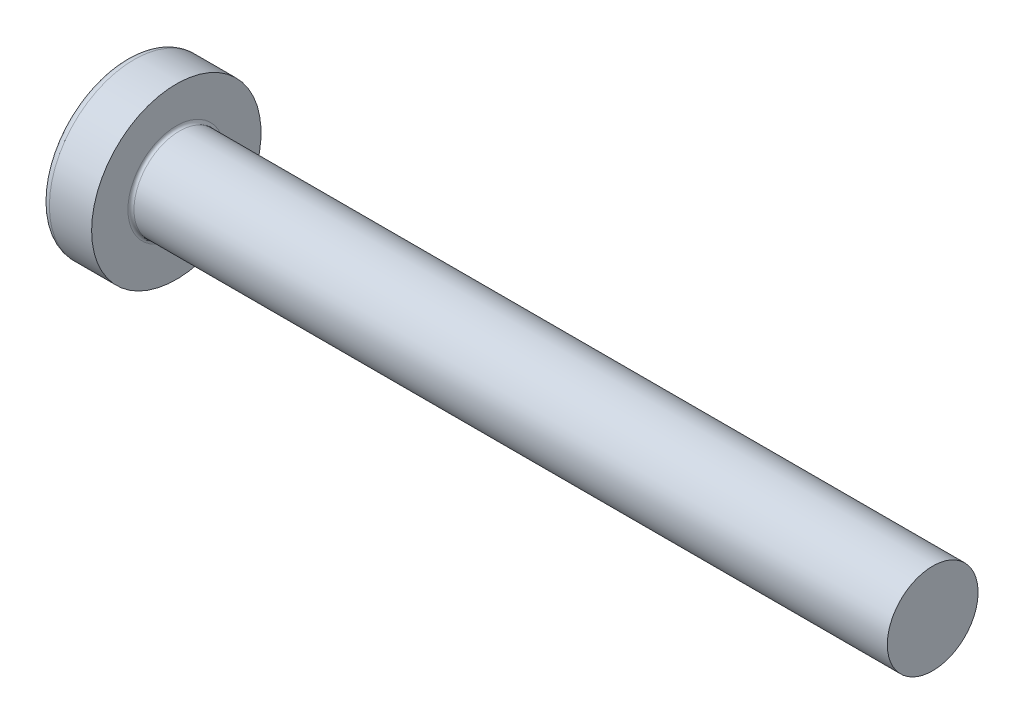
ISO-10303-21;
HEADER;
FILE_DESCRIPTION(('STEP AP214'),'2;1');
FILE_NAME('part.step','',(''),(''),'','','');
FILE_SCHEMA(('AUTOMOTIVE_DESIGN { 1 0 10303 214 1 1 1 1 }'));
ENDSEC;
DATA;
#1=APPLICATION_CONTEXT('core data for automotive mechanical design processes');
#2=APPLICATION_PROTOCOL_DEFINITION('international standard','automotive_design',2000,#1);
#3=PRODUCT_CONTEXT('',#1,'mechanical');
#4=PRODUCT('Part','Part','',(#3));
#5=PRODUCT_RELATED_PRODUCT_CATEGORY('part','',(#4));
#6=PRODUCT_DEFINITION_FORMATION('','',#4);
#7=PRODUCT_DEFINITION_CONTEXT('part definition',#1,'design');
#8=PRODUCT_DEFINITION('design','',#6,#7);
#9=PRODUCT_DEFINITION_SHAPE('','',#8);
#10=(LENGTH_UNIT() NAMED_UNIT(*) SI_UNIT(.MILLI.,.METRE.));
#11=(NAMED_UNIT(*) PLANE_ANGLE_UNIT() SI_UNIT($,.RADIAN.));
#12=(NAMED_UNIT(*) SI_UNIT($,.STERADIAN.) SOLID_ANGLE_UNIT());
#13=UNCERTAINTY_MEASURE_WITH_UNIT(LENGTH_MEASURE(1.E-05),#10,'distance_accuracy_value','');
#14=(GEOMETRIC_REPRESENTATION_CONTEXT(3) GLOBAL_UNCERTAINTY_ASSIGNED_CONTEXT((#13)) GLOBAL_UNIT_ASSIGNED_CONTEXT((#10,
#11,#12)) REPRESENTATION_CONTEXT('',''));
#15=CARTESIAN_POINT('',(0.,0.,0.));
#16=DIRECTION('',(0.,0.,1.));
#17=DIRECTION('',(1.,0.,0.));
#18=AXIS2_PLACEMENT_3D('',#15,#16,#17);
#19=CARTESIAN_POINT('',(5.,0.,0.));
#20=DIRECTION('',(-1.,0.,0.));
#21=DIRECTION('',(0.,1.,0.));
#22=AXIS2_PLACEMENT_3D('',#19,#20,#21);
#23=SPHERICAL_SURFACE('',#22,5.);
#24=CARTESIAN_POINT('',(0.775371598933733,0.,0.));
#25=DIRECTION('',(-1.,0.,0.));
#26=DIRECTION('',(0.,0.,1.));
#27=AXIS2_PLACEMENT_3D('',#24,#25,#26);
#28=CIRCLE('',#27,2.67441860465116);
#29=CARTESIAN_POINT('',(0.775371598933733,0.,2.67441860465116));
#30=VERTEX_POINT('',#29);
#31=EDGE_CURVE('E238',#30,#30,#28,.T.);
#32=ORIENTED_EDGE('',*,*,#31,.T.);
#33=EDGE_LOOP('',(#32));
#34=FACE_BOUND('',#33,.T.);
#35=CARTESIAN_POINT('',(0.0457951200896417,0.,0.));
#36=DIRECTION('',(1.,0.,0.));
#37=DIRECTION('',(0.,0.,-1.));
#38=AXIS2_PLACEMENT_3D('',#35,#36,#37);
#39=CIRCLE('',#38,0.675169614150692);
#40=CARTESIAN_POINT('',(0.0457951200896426,-0.369999999999998,-0.564760133040918));
#41=VERTEX_POINT('',#40);
#42=CARTESIAN_POINT('',(0.0457951200896417,-0.564760133040916,-0.37));
#43=VERTEX_POINT('',#42);
#44=EDGE_CURVE('E374',#41,#43,#39,.F.);
#45=ORIENTED_EDGE('',*,*,#44,.F.);
#46=CARTESIAN_POINT('',(5.,-0.37,0.));
#47=DIRECTION('',(0.,1.,0.));
#48=DIRECTION('',(0.,0.,1.));
#49=AXIS2_PLACEMENT_3D('',#46,#47,#48);
#50=CIRCLE('',#49,4.98629120689917);
#51=CARTESIAN_POINT('',(0.187869734228639,-0.369999999999995,-1.30633162146802));
#52=VERTEX_POINT('',#51);
#53=EDGE_CURVE('E300',#52,#41,#50,.T.);
#54=ORIENTED_EDGE('',*,*,#53,.F.);
#55=CARTESIAN_POINT('',(4.56358262530798,0.,0.875317983305919));
#56=DIRECTION('',(0.446197753347436,0.,-0.894934391398443));
#57=DIRECTION('',(-0.894934391398443,0.,-0.446197753347436));
#58=AXIS2_PLACEMENT_3D('',#55,#56,#57);
#59=CIRCLE('',#58,4.90340272700175);
#60=CARTESIAN_POINT('',(0.18786973422864,0.370000000000005,-1.30633162146802));
#61=VERTEX_POINT('',#60);
#62=EDGE_CURVE('E272',#52,#61,#59,.T.);
#63=ORIENTED_EDGE('',*,*,#62,.T.);
#64=CARTESIAN_POINT('',(5.,0.37,0.));
#65=DIRECTION('',(0.,-1.,0.));
#66=DIRECTION('',(0.,0.,-1.));
#67=AXIS2_PLACEMENT_3D('',#64,#65,#66);
#68=CIRCLE('',#67,4.98629120689917);
#69=CARTESIAN_POINT('',(0.0457951200896425,0.370000000000002,-0.564760133040916));
#70=VERTEX_POINT('',#69);
#71=EDGE_CURVE('E327',#70,#61,#68,.T.);
#72=ORIENTED_EDGE('',*,*,#71,.F.);
#73=CARTESIAN_POINT('',(0.0457951200896417,0.564760133040915,-0.37));
#74=VERTEX_POINT('',#73);
#75=EDGE_CURVE('E393',#74,#70,#39,.F.);
#76=ORIENTED_EDGE('',*,*,#75,.F.);
#77=CARTESIAN_POINT('',(5.,0.,-0.37));
#78=DIRECTION('',(0.,0.,1.));
#79=DIRECTION('',(1.,0.,0.));
#80=AXIS2_PLACEMENT_3D('',#77,#78,#79);
#81=CIRCLE('',#80,4.98629120689917);
#82=CARTESIAN_POINT('',(0.187869734228641,1.30633162146802,-0.37));
#83=VERTEX_POINT('',#82);
#84=EDGE_CURVE('E266',#83,#74,#81,.T.);
#85=ORIENTED_EDGE('',*,*,#84,.F.);
#86=CARTESIAN_POINT('',(4.56358262530798,-0.87531798330592,0.));
#87=DIRECTION('',(0.446197753347436,0.894934391398443,0.));
#88=DIRECTION('',(-0.894934391398442,0.446197753347436,0.));
#89=AXIS2_PLACEMENT_3D('',#86,#87,#88);
#90=CIRCLE('',#89,4.90340272700175);
#91=CARTESIAN_POINT('',(0.18786973422864,1.30633162146802,0.37));
#92=VERTEX_POINT('',#91);
#93=EDGE_CURVE('E269',#83,#92,#90,.T.);
#94=ORIENTED_EDGE('',*,*,#93,.T.);
#95=CARTESIAN_POINT('',(5.,0.,0.37));
#96=DIRECTION('',(0.,0.,-1.));
#97=DIRECTION('',(0.,1.,0.));
#98=AXIS2_PLACEMENT_3D('',#95,#96,#97);
#99=CIRCLE('',#98,4.98629120689917);
#100=CARTESIAN_POINT('',(0.0457951200896417,0.564760133040915,0.37));
#101=VERTEX_POINT('',#100);
#102=EDGE_CURVE('E262',#101,#92,#99,.T.);
#103=ORIENTED_EDGE('',*,*,#102,.F.);
#104=CARTESIAN_POINT('',(0.0457951200896434,0.369999999999998,0.564760133040918));
#105=VERTEX_POINT('',#104);
#106=EDGE_CURVE('E392',#105,#101,#39,.F.);
#107=ORIENTED_EDGE('',*,*,#106,.F.);
#108=CARTESIAN_POINT('',(0.18786973422864,0.369999999999995,1.30633162146802));
#109=VERTEX_POINT('',#108);
#110=EDGE_CURVE('E282',#109,#105,#68,.T.);
#111=ORIENTED_EDGE('',*,*,#110,.F.);
#112=CARTESIAN_POINT('',(4.56358262530798,0.,-0.87531798330592));
#113=DIRECTION('',(0.446197753347436,0.,0.894934391398443));
#114=DIRECTION('',(0.894934391398442,0.,-0.446197753347436));
#115=AXIS2_PLACEMENT_3D('',#112,#113,#114);
#116=CIRCLE('',#115,4.90340272700175);
#117=CARTESIAN_POINT('',(0.18786973422864,-0.370000000000005,1.30633162146802));
#118=VERTEX_POINT('',#117);
#119=EDGE_CURVE('E49',#109,#118,#116,.T.);
#120=ORIENTED_EDGE('',*,*,#119,.T.);
#121=CARTESIAN_POINT('',(0.0457951200896421,-0.370000000000002,0.564760133040916));
#122=VERTEX_POINT('',#121);
#123=EDGE_CURVE('E279',#122,#118,#50,.T.);
#124=ORIENTED_EDGE('',*,*,#123,.F.);
#125=CARTESIAN_POINT('',(0.0457951200896417,-0.564760133040916,0.37));
#126=VERTEX_POINT('',#125);
#127=EDGE_CURVE('E432',#126,#122,#39,.F.);
#128=ORIENTED_EDGE('',*,*,#127,.F.);
#129=CARTESIAN_POINT('',(0.187869734228639,-1.30633162146802,0.37));
#130=VERTEX_POINT('',#129);
#131=EDGE_CURVE('E263',#130,#126,#99,.T.);
#132=ORIENTED_EDGE('',*,*,#131,.F.);
#133=CARTESIAN_POINT('',(4.56358262530798,0.875317983305919,0.));
#134=DIRECTION('',(0.446197753347436,-0.894934391398443,0.));
#135=DIRECTION('',(0.894934391398443,0.446197753347436,0.));
#136=AXIS2_PLACEMENT_3D('',#133,#134,#135);
#137=CIRCLE('',#136,4.90340272700175);
#138=CARTESIAN_POINT('',(0.18786973422864,-1.30633162146802,-0.37));
#139=VERTEX_POINT('',#138);
#140=EDGE_CURVE('E259',#130,#139,#137,.T.);
#141=ORIENTED_EDGE('',*,*,#140,.T.);
#142=EDGE_CURVE('E64',#43,#139,#81,.T.);
#143=ORIENTED_EDGE('',*,*,#142,.F.);
#144=EDGE_LOOP('',(#45,#54,#63,#72,#76,#85,#94,#103,#107,#111,#120,#124,#128,#132,#141,#143));
#145=FACE_BOUND('',#144,.T.);
#146=ADVANCED_FACE('F35',(#34,#145),#23,.T.);
#147=CARTESIAN_POINT('',(1.75,0.527482331818931,-0.37));
#148=DIRECTION('',(0.,0.,1.));
#149=DIRECTION('',(1.,0.,0.));
#150=AXIS2_PLACEMENT_3D('',#147,#148,#149);
#151=PLANE('',#150);
#152=ORIENTED_EDGE('',*,*,#84,.T.);
#153=CARTESIAN_POINT('',(-0.987293237053716,0.649401255967161,-0.37));
#154=CARTESIAN_POINT('',(-0.781914975317084,0.632865887002871,-0.37));
#155=CARTESIAN_POINT('',(-0.576547882393372,0.616188977635081,-0.37));
#156=CARTESIAN_POINT('',(-0.165841599226327,0.582441031964227,-0.37));
#157=CARTESIAN_POINT('',(0.0394975903090452,0.56536998705488,-0.37));
#158=CARTESIAN_POINT('',(0.450133475422572,0.530723441326535,-0.37));
#159=CARTESIAN_POINT('',(0.655430171010573,0.513147940624557,-0.37));
#160=CARTESIAN_POINT('',(1.06596140177934,0.477314957985794,-0.37));
#161=CARTESIAN_POINT('',(1.2711959378071,0.459057485806066,-0.37));
#162=CARTESIAN_POINT('',(1.61065292365626,0.428051938688768,-0.37));
#163=CARTESIAN_POINT('',(1.74490059995643,0.415580824990931,-0.37));
#164=CARTESIAN_POINT('',(2.01334321762763,0.390092023404979,-0.37));
#165=CARTESIAN_POINT('',(2.14753815934577,0.377074339177353,-0.37));
#166=CARTESIAN_POINT('',(2.41586354151957,0.350315629452843,-0.37));
#167=CARTESIAN_POINT('',(2.5499939784531,0.33657456817765,-0.37));
#168=CARTESIAN_POINT('',(2.81814173295471,0.308004077741875,-0.37));
#169=CARTESIAN_POINT('',(2.95215904765134,0.293174621747065,-0.37));
#170=CARTESIAN_POINT('',(3.0860955068368,0.277618485071816,-0.37));
#171=B_SPLINE_CURVE_WITH_KNOTS('',3,(#153,#154,#155,#156,#157,#158,#159,#160,#161,#162,#163,
#164,#165,#166,#167,#168,#169,#170),.UNSPECIFIED.,.F.,.F.,(4,2,2,2,2,2,2,2,4),(0.,
0.618128793984691,1.23627109812525,1.85441325887562,2.4725465791681,2.87702276218609,
3.28149623678161,3.68598973550942,4.09049321032311),.UNSPECIFIED.);
#172=CARTESIAN_POINT('',(1.75,0.415013252800437,-0.370000000000001));
#173=VERTEX_POINT('',#172);
#174=EDGE_CURVE('E416',#74,#173,#171,.T.);
#175=ORIENTED_EDGE('',*,*,#174,.T.);
#176=DIRECTION('',(0.,1.,0.));
#177=VECTOR('',#176,1.);
#178=CARTESIAN_POINT('',(1.75,-0.527482331818931,-0.37));
#179=LINE('',#178,#177);
#180=CARTESIAN_POINT('',(1.75,0.527482331818931,-0.37));
#181=VERTEX_POINT('',#180);
#182=EDGE_CURVE('E356',#173,#181,#179,.T.);
#183=ORIENTED_EDGE('',*,*,#182,.T.);
#184=DIRECTION('',(0.894934391398442,-0.446197753347436,0.));
#185=VECTOR('',#184,1.);
#186=CARTESIAN_POINT('',(0.,1.4,-0.37));
#187=LINE('',#186,#185);
#188=EDGE_CURVE('E239',#83,#181,#187,.T.);
#189=ORIENTED_EDGE('',*,*,#188,.F.);
#190=EDGE_LOOP('',(#152,#175,#183,#189));
#191=FACE_BOUND('',#190,.T.);
#192=ADVANCED_FACE('F194',(#191),#151,.T.);
#193=CARTESIAN_POINT('',(1.75,-0.527482331818931,-0.37));
#194=VERTEX_POINT('',#193);
#195=CARTESIAN_POINT('',(1.75,-0.415013252800437,-0.370000000000001));
#196=VERTEX_POINT('',#195);
#197=EDGE_CURVE('E247',#194,#196,#179,.T.);
#198=ORIENTED_EDGE('',*,*,#197,.T.);
#199=CARTESIAN_POINT('',(-0.987293237053716,-0.649401255967161,-0.37));
#200=CARTESIAN_POINT('',(-0.781914975317084,-0.632865887002871,-0.37));
#201=CARTESIAN_POINT('',(-0.576547882393372,-0.616188977635081,-0.37));
#202=CARTESIAN_POINT('',(-0.165841599226327,-0.582441031964227,-0.37));
#203=CARTESIAN_POINT('',(0.0394975903090452,-0.56536998705488,-0.37));
#204=CARTESIAN_POINT('',(0.450133475422572,-0.530723441326535,-0.37));
#205=CARTESIAN_POINT('',(0.655430171010573,-0.513147940624557,-0.37));
#206=CARTESIAN_POINT('',(1.06596140177934,-0.477314957985794,-0.37));
#207=CARTESIAN_POINT('',(1.2711959378071,-0.459057485806066,-0.37));
#208=CARTESIAN_POINT('',(1.61065292365626,-0.428051938688768,-0.37));
#209=CARTESIAN_POINT('',(1.74490059995643,-0.415580824990931,-0.37));
#210=CARTESIAN_POINT('',(2.01334321762763,-0.390092023404979,-0.37));
#211=CARTESIAN_POINT('',(2.14753815934577,-0.377074339177353,-0.37));
#212=CARTESIAN_POINT('',(2.41586354151957,-0.350315629452843,-0.37));
#213=CARTESIAN_POINT('',(2.5499939784531,-0.33657456817765,-0.37));
#214=CARTESIAN_POINT('',(2.81814173295471,-0.308004077741875,-0.37));
#215=CARTESIAN_POINT('',(2.95215904765134,-0.293174621747065,-0.37));
#216=CARTESIAN_POINT('',(3.0860955068368,-0.277618485071816,-0.37));
#217=B_SPLINE_CURVE_WITH_KNOTS('',3,(#199,#200,#201,#202,#203,#204,#205,#206,#207,#208,#209,
#210,#211,#212,#213,#214,#215,#216),.UNSPECIFIED.,.F.,.F.,(4,2,2,2,2,2,2,2,4),(0.,
0.618128793984691,1.23627109812525,1.85441325887562,2.4725465791681,2.87702276218609,
3.28149623678161,3.68598973550942,4.09049321032311),.UNSPECIFIED.);
#218=EDGE_CURVE('E391',#196,#43,#217,.F.);
#219=ORIENTED_EDGE('',*,*,#218,.T.);
#220=ORIENTED_EDGE('',*,*,#142,.T.);
#221=DIRECTION('',(0.894934391398442,0.446197753347436,0.));
#222=VECTOR('',#221,1.);
#223=CARTESIAN_POINT('',(0.,-1.4,-0.37));
#224=LINE('',#223,#222);
#225=EDGE_CURVE('E330',#139,#194,#224,.T.);
#226=ORIENTED_EDGE('',*,*,#225,.T.);
#227=EDGE_LOOP('',(#198,#219,#220,#226));
#228=FACE_BOUND('',#227,.T.);
#229=ADVANCED_FACE('F200',(#228),#151,.T.);
#230=CARTESIAN_POINT('',(1.75,-0.527482331818931,0.37));
#231=DIRECTION('',(0.,0.,-1.));
#232=DIRECTION('',(0.,1.,0.));
#233=AXIS2_PLACEMENT_3D('',#230,#231,#232);
#234=PLANE('',#233);
#235=DIRECTION('',(0.,-1.,0.));
#236=VECTOR('',#235,1.);
#237=CARTESIAN_POINT('',(1.75,0.527482331818931,0.37));
#238=LINE('',#237,#236);
#239=CARTESIAN_POINT('',(1.75,0.527482331818931,0.37));
#240=VERTEX_POINT('',#239);
#241=CARTESIAN_POINT('',(1.75,0.415013252800437,0.370000000000001));
#242=VERTEX_POINT('',#241);
#243=EDGE_CURVE('E339',#240,#242,#238,.T.);
#244=ORIENTED_EDGE('',*,*,#243,.T.);
#245=CARTESIAN_POINT('',(-0.987293237053716,0.649401255967161,0.37));
#246=CARTESIAN_POINT('',(-0.781914975317084,0.632865887002871,0.37));
#247=CARTESIAN_POINT('',(-0.576547882393372,0.616188977635081,0.37));
#248=CARTESIAN_POINT('',(-0.165841599226327,0.582441031964227,0.37));
#249=CARTESIAN_POINT('',(0.0394975903090453,0.56536998705488,0.37));
#250=CARTESIAN_POINT('',(0.450133475422572,0.530723441326535,0.37));
#251=CARTESIAN_POINT('',(0.655430171010574,0.513147940624557,0.37));
#252=CARTESIAN_POINT('',(1.06596140177934,0.477314957985794,0.37));
#253=CARTESIAN_POINT('',(1.2711959378071,0.459057485806066,0.37));
#254=CARTESIAN_POINT('',(1.61065292365626,0.428051938688768,0.37));
#255=CARTESIAN_POINT('',(1.74490059995643,0.415580824990931,0.37));
#256=CARTESIAN_POINT('',(2.01334321762763,0.39009202340498,0.37));
#257=CARTESIAN_POINT('',(2.14753815934577,0.377074339177353,0.37));
#258=CARTESIAN_POINT('',(2.41586354151957,0.350315629452843,0.37));
#259=CARTESIAN_POINT('',(2.5499939784531,0.33657456817765,0.37));
#260=CARTESIAN_POINT('',(2.81814173295471,0.308004077741875,0.37));
#261=CARTESIAN_POINT('',(2.95215904765134,0.293174621747065,0.37));
#262=CARTESIAN_POINT('',(3.0860955068368,0.277618485071816,0.37));
#263=B_SPLINE_CURVE_WITH_KNOTS('',3,(#245,#246,#247,#248,#249,#250,#251,#252,#253,#254,#255,
#256,#257,#258,#259,#260,#261,#262),.UNSPECIFIED.,.F.,.F.,(4,2,2,2,2,2,2,2,4),(0.,
0.618128793984691,1.23627109812525,1.85441325887562,2.4725465791681,2.87702276218609,
3.28149623678161,3.68598973550942,4.09049321032311),.UNSPECIFIED.);
#264=EDGE_CURVE('E671',#242,#101,#263,.F.);
#265=ORIENTED_EDGE('',*,*,#264,.T.);
#266=ORIENTED_EDGE('',*,*,#102,.T.);
#267=DIRECTION('',(0.894934391398442,-0.446197753347436,0.));
#268=VECTOR('',#267,1.);
#269=CARTESIAN_POINT('',(0.,1.4,0.37));
#270=LINE('',#269,#268);
#271=EDGE_CURVE('E244',#92,#240,#270,.T.);
#272=ORIENTED_EDGE('',*,*,#271,.T.);
#273=EDGE_LOOP('',(#244,#265,#266,#272));
#274=FACE_BOUND('',#273,.T.);
#275=ADVANCED_FACE('F412',(#274),#234,.T.);
#276=ORIENTED_EDGE('',*,*,#131,.T.);
#277=CARTESIAN_POINT('',(-0.987293237069635,-0.649401255968442,0.37));
#278=CARTESIAN_POINT('',(-0.781914975331301,-0.632865887004023,0.37));
#279=CARTESIAN_POINT('',(-0.576547882405888,-0.616188977636102,0.37));
#280=CARTESIAN_POINT('',(-0.16584159923544,-0.582441031964983,0.37));
#281=CARTESIAN_POINT('',(0.0394975903016338,-0.5653699870555,0.37));
#282=CARTESIAN_POINT('',(0.450133475420601,-0.530723441326706,0.37));
#283=CARTESIAN_POINT('',(0.655430171012341,-0.513147940624409,0.37));
#284=CARTESIAN_POINT('',(1.06596140178858,-0.477314957984981,0.37));
#285=CARTESIAN_POINT('',(1.27119593782008,-0.459057485804908,0.37));
#286=CARTESIAN_POINT('',(1.61065292367297,-0.428051938687225,0.37));
#287=CARTESIAN_POINT('',(1.74490059997313,-0.415580824989368,0.37));
#288=CARTESIAN_POINT('',(2.01334321764434,-0.390092023403371,0.37));
#289=CARTESIAN_POINT('',(2.14753815936247,-0.377074339175718,0.37));
#290=CARTESIAN_POINT('',(2.41586354153627,-0.350315629451146,0.37));
#291=CARTESIAN_POINT('',(2.54999397846979,-0.336574568175918,0.37));
#292=CARTESIAN_POINT('',(2.8181417329714,-0.308004077740054,0.37));
#293=CARTESIAN_POINT('',(2.95215904766802,-0.29317462174519,0.37));
#294=CARTESIAN_POINT('',(3.08609550685347,-0.277618485069873,0.37));
#295=B_SPLINE_CURVE_WITH_KNOTS('',3,(#277,#278,#279,#280,#281,#282,#283,#284,#285,#286,#287,
#288,#289,#290,#291,#292,#293,#294),.UNSPECIFIED.,.F.,.F.,(4,2,2,2,2,2,2,2,4),(0.,
0.61812879398981,1.23627109813549,1.85441325889711,2.47254657920086,2.87702276221884,
3.28149623681437,3.68598973554218,4.09049321035586),.UNSPECIFIED.);
#296=CARTESIAN_POINT('',(1.75,-0.415013252800437,0.37));
#297=VERTEX_POINT('',#296);
#298=EDGE_CURVE('E433',#126,#297,#295,.T.);
#299=ORIENTED_EDGE('',*,*,#298,.T.);
#300=CARTESIAN_POINT('',(1.75,-0.527482331818932,0.37));
#301=VERTEX_POINT('',#300);
#302=EDGE_CURVE('E341',#297,#301,#238,.T.);
#303=ORIENTED_EDGE('',*,*,#302,.T.);
#304=DIRECTION('',(0.894934391398443,0.446197753347436,0.));
#305=VECTOR('',#304,1.);
#306=CARTESIAN_POINT('',(0.,-1.4,0.37));
#307=LINE('',#306,#305);
#308=EDGE_CURVE('E332',#130,#301,#307,.T.);
#309=ORIENTED_EDGE('',*,*,#308,.F.);
#310=EDGE_LOOP('',(#276,#299,#303,#309));
#311=FACE_BOUND('',#310,.T.);
#312=ADVANCED_FACE('F519',(#311),#234,.T.);
#313=CARTESIAN_POINT('',(1.75,0.527482331818931,0.37));
#314=DIRECTION('',(0.446197753347436,0.894934391398443,0.));
#315=DIRECTION('',(-0.894934391398442,0.446197753347436,0.));
#316=AXIS2_PLACEMENT_3D('',#313,#314,#315);
#317=PLANE('',#316);
#318=CARTESIAN_POINT('',(2.6696526882832,0.0689604923233249,0.));
#319=DIRECTION('',(0.446197753347436,0.894934391398443,0.));
#320=DIRECTION('',(-0.894934391398443,0.446197753347436,0.));
#321=AXIS2_PLACEMENT_3D('',#318,#319,#320);
#322=ELLIPSE('',#321,1.10195897609154,0.486831694838766);
#323=CARTESIAN_POINT('',(1.75,0.527482331818932,0.175779377683682));
#324=VERTEX_POINT('',#323);
#325=CARTESIAN_POINT('',(1.75,0.527482331818932,-0.175779377683682));
#326=VERTEX_POINT('',#325);
#327=EDGE_CURVE('E305',#324,#326,#322,.F.);
#328=ORIENTED_EDGE('',*,*,#327,.F.);
#329=DIRECTION('',(0.,0.,-1.));
#330=VECTOR('',#329,1.);
#331=CARTESIAN_POINT('',(1.75,0.527482331818931,0.37));
#332=LINE('',#331,#330);
#333=EDGE_CURVE('E342',#240,#324,#332,.T.);
#334=ORIENTED_EDGE('',*,*,#333,.F.);
#335=ORIENTED_EDGE('',*,*,#271,.F.);
#336=ORIENTED_EDGE('',*,*,#93,.F.);
#337=ORIENTED_EDGE('',*,*,#188,.T.);
#338=EDGE_CURVE('E344',#326,#181,#332,.T.);
#339=ORIENTED_EDGE('',*,*,#338,.F.);
#340=EDGE_LOOP('',(#328,#334,#335,#336,#337,#339));
#341=FACE_BOUND('',#340,.T.);
#342=ADVANCED_FACE('F410',(#341),#317,.F.);
#343=CARTESIAN_POINT('',(0.,-1.4,-0.37));
#344=DIRECTION('',(0.446197753347436,-0.894934391398443,0.));
#345=DIRECTION('',(0.894934391398443,0.446197753347436,0.));
#346=AXIS2_PLACEMENT_3D('',#343,#344,#345);
#347=PLANE('',#346);
#348=CARTESIAN_POINT('',(2.6696526882832,-0.0689604923233252,0.));
#349=DIRECTION('',(0.446197753347436,-0.894934391398443,0.));
#350=DIRECTION('',(-0.894934391398443,-0.446197753347436,0.));
#351=AXIS2_PLACEMENT_3D('',#348,#349,#350);
#352=ELLIPSE('',#351,1.10195897609154,0.486831694838766);
#353=CARTESIAN_POINT('',(1.75,-0.527482331818932,-0.175779377683681));
#354=VERTEX_POINT('',#353);
#355=CARTESIAN_POINT('',(1.75,-0.527482331818932,0.17577937768368));
#356=VERTEX_POINT('',#355);
#357=EDGE_CURVE('E673',#354,#356,#352,.F.);
#358=ORIENTED_EDGE('',*,*,#357,.F.);
#359=DIRECTION('',(0.,0.,1.));
#360=VECTOR('',#359,1.);
#361=CARTESIAN_POINT('',(1.75,-0.527482331818931,-0.37));
#362=LINE('',#361,#360);
#363=EDGE_CURVE('E335',#194,#354,#362,.T.);
#364=ORIENTED_EDGE('',*,*,#363,.F.);
#365=ORIENTED_EDGE('',*,*,#225,.F.);
#366=ORIENTED_EDGE('',*,*,#140,.F.);
#367=ORIENTED_EDGE('',*,*,#308,.T.);
#368=EDGE_CURVE('E338',#356,#301,#362,.T.);
#369=ORIENTED_EDGE('',*,*,#368,.F.);
#370=EDGE_LOOP('',(#358,#364,#365,#366,#367,#369));
#371=FACE_BOUND('',#370,.T.);
#372=ADVANCED_FACE('F506',(#371),#347,.F.);
#373=CARTESIAN_POINT('',(1.75,0.527482331818931,-0.37));
#374=DIRECTION('',(-1.,0.,0.));
#375=DIRECTION('',(0.,0.,1.));
#376=AXIS2_PLACEMENT_3D('',#373,#374,#375);
#377=PLANE('',#376);
#378=DIRECTION('',(0.,1.,0.));
#379=VECTOR('',#378,1.);
#380=CARTESIAN_POINT('',(1.75,-0.370000000000002,0.52748233181893));
#381=LINE('',#380,#379);
#382=CARTESIAN_POINT('',(1.75,-0.370000000000002,0.52748233181893));
#383=VERTEX_POINT('',#382);
#384=CARTESIAN_POINT('',(1.75,-0.175779377683686,0.52748233181893));
#385=VERTEX_POINT('',#384);
#386=EDGE_CURVE('E320',#383,#385,#381,.T.);
#387=ORIENTED_EDGE('',*,*,#386,.T.);
#388=CARTESIAN_POINT('',(1.75,0.,0.));
#389=DIRECTION('',(-1.,0.,0.));
#390=DIRECTION('',(0.,0.,1.));
#391=AXIS2_PLACEMENT_3D('',#388,#389,#390);
#392=CIRCLE('',#391,0.556);
#393=CARTESIAN_POINT('',(1.75,-0.370000000000001,0.415013252800436));
#394=VERTEX_POINT('',#393);
#395=EDGE_CURVE('E701',#394,#385,#392,.T.);
#396=ORIENTED_EDGE('',*,*,#395,.F.);
#397=DIRECTION('',(0.,0.,-1.));
#398=VECTOR('',#397,1.);
#399=CARTESIAN_POINT('',(1.75,-0.370000000000002,0.52748233181893));
#400=LINE('',#399,#398);
#401=EDGE_CURVE('E316',#383,#394,#400,.T.);
#402=ORIENTED_EDGE('',*,*,#401,.F.);
#403=EDGE_LOOP('',(#387,#396,#402));
#404=FACE_BOUND('',#403,.T.);
#405=ADVANCED_FACE('F499',(#404),#377,.T.);
#406=ORIENTED_EDGE('',*,*,#302,.F.);
#407=EDGE_CURVE('E706',#356,#297,#392,.T.);
#408=ORIENTED_EDGE('',*,*,#407,.F.);
#409=ORIENTED_EDGE('',*,*,#368,.T.);
#410=EDGE_LOOP('',(#406,#408,#409));
#411=FACE_BOUND('',#410,.T.);
#412=ADVANCED_FACE('F492',(#411),#377,.T.);
#413=ORIENTED_EDGE('',*,*,#363,.T.);
#414=EDGE_CURVE('E385',#196,#354,#392,.T.);
#415=ORIENTED_EDGE('',*,*,#414,.F.);
#416=ORIENTED_EDGE('',*,*,#197,.F.);
#417=EDGE_LOOP('',(#413,#415,#416));
#418=FACE_BOUND('',#417,.T.);
#419=ADVANCED_FACE('F486',(#418),#377,.T.);
#420=CARTESIAN_POINT('',(1.75,-0.369999999999998,-0.415013252800438));
#421=VERTEX_POINT('',#420);
#422=CARTESIAN_POINT('',(1.75,-0.369999999999998,-0.527482331818933));
#423=VERTEX_POINT('',#422);
#424=EDGE_CURVE('E319',#421,#423,#400,.T.);
#425=ORIENTED_EDGE('',*,*,#424,.F.);
#426=CARTESIAN_POINT('',(1.75,-0.17577937768368,-0.527482331818932));
#427=VERTEX_POINT('',#426);
#428=EDGE_CURVE('E56',#427,#421,#392,.T.);
#429=ORIENTED_EDGE('',*,*,#428,.F.);
#430=DIRECTION('',(0.,-1.,0.));
#431=VECTOR('',#430,1.);
#432=CARTESIAN_POINT('',(1.75,0.370000000000002,-0.52748233181893));
#433=LINE('',#432,#431);
#434=EDGE_CURVE('E315',#427,#423,#433,.T.);
#435=ORIENTED_EDGE('',*,*,#434,.T.);
#436=EDGE_LOOP('',(#425,#429,#435));
#437=FACE_BOUND('',#436,.T.);
#438=ADVANCED_FACE('F380',(#437),#377,.T.);
#439=CARTESIAN_POINT('',(1.75,0.370000000000002,-0.52748233181893));
#440=VERTEX_POINT('',#439);
#441=CARTESIAN_POINT('',(1.75,0.175779377683684,-0.527482331818931));
#442=VERTEX_POINT('',#441);
#443=EDGE_CURVE('E312',#440,#442,#433,.T.);
#444=ORIENTED_EDGE('',*,*,#443,.T.);
#445=CARTESIAN_POINT('',(1.75,0.370000000000001,-0.415013252800436));
#446=VERTEX_POINT('',#445);
#447=EDGE_CURVE('E384',#446,#442,#392,.T.);
#448=ORIENTED_EDGE('',*,*,#447,.F.);
#449=DIRECTION('',(0.,0.,1.));
#450=VECTOR('',#449,1.);
#451=CARTESIAN_POINT('',(1.75,0.370000000000002,-0.52748233181893));
#452=LINE('',#451,#450);
#453=EDGE_CURVE('E324',#440,#446,#452,.T.);
#454=ORIENTED_EDGE('',*,*,#453,.F.);
#455=EDGE_LOOP('',(#444,#448,#454));
#456=FACE_BOUND('',#455,.T.);
#457=ADVANCED_FACE('F474',(#456),#377,.T.);
#458=ORIENTED_EDGE('',*,*,#182,.F.);
#459=EDGE_CURVE('E690',#326,#173,#392,.T.);
#460=ORIENTED_EDGE('',*,*,#459,.F.);
#461=ORIENTED_EDGE('',*,*,#338,.T.);
#462=EDGE_LOOP('',(#458,#460,#461));
#463=FACE_BOUND('',#462,.T.);
#464=ADVANCED_FACE('F467',(#463),#377,.T.);
#465=ORIENTED_EDGE('',*,*,#333,.T.);
#466=EDGE_CURVE('E692',#242,#324,#392,.T.);
#467=ORIENTED_EDGE('',*,*,#466,.F.);
#468=ORIENTED_EDGE('',*,*,#243,.F.);
#469=EDGE_LOOP('',(#465,#467,#468));
#470=FACE_BOUND('',#469,.T.);
#471=ADVANCED_FACE('F461',(#470),#377,.T.);
#472=CARTESIAN_POINT('',(1.75,0.369999999999998,0.527482331818932));
#473=DIRECTION('',(0.,-1.,0.));
#474=DIRECTION('',(1.,0.,0.));
#475=AXIS2_PLACEMENT_3D('',#472,#473,#474);
#476=PLANE('',#475);
#477=ORIENTED_EDGE('',*,*,#110,.T.);
#478=CARTESIAN_POINT('',(-0.987293237069635,0.369999999999998,0.649401255968443));
#479=CARTESIAN_POINT('',(-0.781914975331301,0.369999999999998,0.632865887004024));
#480=CARTESIAN_POINT('',(-0.576547882405888,0.369999999999998,0.616188977636103));
#481=CARTESIAN_POINT('',(-0.16584159923544,0.369999999999998,0.582441031964984));
#482=CARTESIAN_POINT('',(0.0394975903016338,0.369999999999998,0.565369987055501));
#483=CARTESIAN_POINT('',(0.450133475420601,0.369999999999998,0.530723441326707));
#484=CARTESIAN_POINT('',(0.655430171012341,0.369999999999998,0.51314794062441));
#485=CARTESIAN_POINT('',(1.06596140178858,0.369999999999998,0.477314957984982));
#486=CARTESIAN_POINT('',(1.27119593782008,0.369999999999998,0.459057485804909));
#487=CARTESIAN_POINT('',(1.61065292367297,0.369999999999999,0.428051938687226));
#488=CARTESIAN_POINT('',(1.74490059997313,0.369999999999999,0.415580824989369));
#489=CARTESIAN_POINT('',(2.01334321764434,0.369999999999999,0.390092023403372));
#490=CARTESIAN_POINT('',(2.14753815936247,0.369999999999999,0.37707433917572));
#491=CARTESIAN_POINT('',(2.41586354153627,0.369999999999999,0.350315629451147));
#492=CARTESIAN_POINT('',(2.54999397846979,0.369999999999999,0.336574568175919));
#493=CARTESIAN_POINT('',(2.8181417329714,0.369999999999999,0.308004077740055));
#494=CARTESIAN_POINT('',(2.95215904766802,0.369999999999999,0.293174621745191));
#495=CARTESIAN_POINT('',(3.08609550685347,0.369999999999999,0.277618485069875));
#496=B_SPLINE_CURVE_WITH_KNOTS('',3,(#478,#479,#480,#481,#482,#483,#484,#485,#486,#487,#488,
#489,#490,#491,#492,#493,#494,#495),.UNSPECIFIED.,.F.,.F.,(4,2,2,2,2,2,2,2,4),(0.,
0.61812879398981,1.23627109813549,1.85441325889711,2.47254657920086,2.87702276221884,
3.28149623681436,3.68598973554218,4.09049321035586),.UNSPECIFIED.);
#497=CARTESIAN_POINT('',(1.75,0.369999999999999,0.415013252800439));
#498=VERTEX_POINT('',#497);
#499=EDGE_CURVE('E670',#105,#498,#496,.T.);
#500=ORIENTED_EDGE('',*,*,#499,.T.);
#501=CARTESIAN_POINT('',(1.75,0.369999999999998,0.527482331818932));
#502=VERTEX_POINT('',#501);
#503=EDGE_CURVE('E297',#498,#502,#452,.T.);
#504=ORIENTED_EDGE('',*,*,#503,.T.);
#505=DIRECTION('',(0.894934391398442,0.,-0.446197753347436));
#506=VECTOR('',#505,1.);
#507=CARTESIAN_POINT('',(0.,0.369999999999995,1.4));
#508=LINE('',#507,#506);
#509=EDGE_CURVE('E290',#109,#502,#508,.T.);
#510=ORIENTED_EDGE('',*,*,#509,.F.);
#511=EDGE_LOOP('',(#477,#500,#504,#510));
#512=FACE_BOUND('',#511,.T.);
#513=ADVANCED_FACE('F294',(#512),#476,.T.);
#514=CARTESIAN_POINT('',(1.75,-0.369999999999998,-0.527482331818933));
#515=DIRECTION('',(0.,1.,0.));
#516=DIRECTION('',(0.,0.,1.));
#517=AXIS2_PLACEMENT_3D('',#514,#515,#516);
#518=PLANE('',#517);
#519=ORIENTED_EDGE('',*,*,#401,.T.);
#520=CARTESIAN_POINT('',(-0.987293237053716,-0.370000000000002,0.64940125596716));
#521=CARTESIAN_POINT('',(-0.781914975317084,-0.370000000000002,0.63286588700287));
#522=CARTESIAN_POINT('',(-0.576547882393372,-0.370000000000002,0.61618897763508));
#523=CARTESIAN_POINT('',(-0.165841599226327,-0.370000000000002,0.582441031964225));
#524=CARTESIAN_POINT('',(0.0394975903090451,-0.370000000000002,0.565369987054878));
#525=CARTESIAN_POINT('',(0.450133475422572,-0.370000000000002,0.530723441326533));
#526=CARTESIAN_POINT('',(0.655430171010573,-0.370000000000002,0.513147940624555));
#527=CARTESIAN_POINT('',(1.06596140177934,-0.370000000000002,0.477314957985793));
#528=CARTESIAN_POINT('',(1.2711959378071,-0.370000000000002,0.459057485806065));
#529=CARTESIAN_POINT('',(1.61065292365626,-0.370000000000001,0.428051938688767));
#530=CARTESIAN_POINT('',(1.74490059995642,-0.370000000000001,0.41558082499093));
#531=CARTESIAN_POINT('',(2.01334321762763,-0.370000000000001,0.390092023404978));
#532=CARTESIAN_POINT('',(2.14753815934577,-0.370000000000001,0.377074339177352));
#533=CARTESIAN_POINT('',(2.41586354151957,-0.370000000000001,0.350315629452841));
#534=CARTESIAN_POINT('',(2.5499939784531,-0.370000000000001,0.336574568177649));
#535=CARTESIAN_POINT('',(2.81814173295471,-0.370000000000001,0.308004077741874));
#536=CARTESIAN_POINT('',(2.95215904765134,-0.370000000000001,0.293174621747063));
#537=CARTESIAN_POINT('',(3.0860955068368,-0.370000000000001,0.277618485071814));
#538=B_SPLINE_CURVE_WITH_KNOTS('',3,(#520,#521,#522,#523,#524,#525,#526,#527,#528,#529,#530,
#531,#532,#533,#534,#535,#536,#537),.UNSPECIFIED.,.F.,.F.,(4,2,2,2,2,2,2,2,4),(0.,
0.618128793984691,1.23627109812525,1.85441325887562,2.4725465791681,2.87702276218609,
3.28149623678161,3.68598973550942,4.09049321032311),.UNSPECIFIED.);
#539=EDGE_CURVE('E425',#394,#122,#538,.F.);
#540=ORIENTED_EDGE('',*,*,#539,.T.);
#541=ORIENTED_EDGE('',*,*,#123,.T.);
#542=DIRECTION('',(0.894934391398442,0.,-0.446197753347436));
#543=VECTOR('',#542,1.);
#544=CARTESIAN_POINT('',(0.,-0.370000000000005,1.4));
#545=LINE('',#544,#543);
#546=EDGE_CURVE('E292',#118,#383,#545,.T.);
#547=ORIENTED_EDGE('',*,*,#546,.T.);
#548=EDGE_LOOP('',(#519,#540,#541,#547));
#549=FACE_BOUND('',#548,.T.);
#550=ADVANCED_FACE('F229',(#549),#518,.T.);
#551=CARTESIAN_POINT('',(1.75,-0.370000000000002,0.52748233181893));
#552=DIRECTION('',(0.446197753347436,0.,0.894934391398443));
#553=DIRECTION('',(-0.894934391398442,0.,0.446197753347436));
#554=AXIS2_PLACEMENT_3D('',#551,#552,#553);
#555=PLANE('',#554);
#556=CARTESIAN_POINT('',(2.6696526882832,0.,0.0689604923233248));
#557=DIRECTION('',(0.446197753347436,0.,0.894934391398443));
#558=DIRECTION('',(-0.894934391398443,0.,0.446197753347436));
#559=AXIS2_PLACEMENT_3D('',#556,#557,#558);
#560=ELLIPSE('',#559,1.10195897609154,0.486831694838766);
#561=CARTESIAN_POINT('',(1.75,0.175779377683682,0.527482331818932));
#562=VERTEX_POINT('',#561);
#563=EDGE_CURVE('E423',#385,#562,#560,.F.);
#564=ORIENTED_EDGE('',*,*,#563,.F.);
#565=ORIENTED_EDGE('',*,*,#386,.F.);
#566=ORIENTED_EDGE('',*,*,#546,.F.);
#567=ORIENTED_EDGE('',*,*,#119,.F.);
#568=ORIENTED_EDGE('',*,*,#509,.T.);
#569=EDGE_CURVE('E323',#562,#502,#381,.T.);
#570=ORIENTED_EDGE('',*,*,#569,.F.);
#571=EDGE_LOOP('',(#564,#565,#566,#567,#568,#570));
#572=FACE_BOUND('',#571,.T.);
#573=ADVANCED_FACE('F288',(#572),#555,.F.);
#574=CARTESIAN_POINT('',(0.,0.370000000000005,-1.4));
#575=DIRECTION('',(0.446197753347436,0.,-0.894934391398443));
#576=DIRECTION('',(0.894934391398443,0.,0.446197753347436));
#577=AXIS2_PLACEMENT_3D('',#574,#575,#576);
#578=PLANE('',#577);
#579=CARTESIAN_POINT('',(2.6696526882832,0.,-0.0689604923233253));
#580=DIRECTION('',(0.446197753347436,0.,-0.894934391398443));
#581=DIRECTION('',(-0.894934391398443,0.,-0.446197753347436));
#582=AXIS2_PLACEMENT_3D('',#579,#580,#581);
#583=ELLIPSE('',#582,1.10195897609154,0.486831694838766);
#584=EDGE_CURVE('E378',#442,#427,#583,.F.);
#585=ORIENTED_EDGE('',*,*,#584,.F.);
#586=ORIENTED_EDGE('',*,*,#443,.F.);
#587=DIRECTION('',(0.894934391398442,0.,0.446197753347436));
#588=VECTOR('',#587,1.);
#589=CARTESIAN_POINT('',(0.,0.370000000000005,-1.4));
#590=LINE('',#589,#588);
#591=EDGE_CURVE('E302',#61,#440,#590,.T.);
#592=ORIENTED_EDGE('',*,*,#591,.F.);
#593=ORIENTED_EDGE('',*,*,#62,.F.);
#594=DIRECTION('',(0.894934391398443,0.,0.446197753347436));
#595=VECTOR('',#594,1.);
#596=CARTESIAN_POINT('',(0.,-0.369999999999995,-1.4));
#597=LINE('',#596,#595);
#598=EDGE_CURVE('E309',#52,#423,#597,.T.);
#599=ORIENTED_EDGE('',*,*,#598,.T.);
#600=ORIENTED_EDGE('',*,*,#434,.F.);
#601=EDGE_LOOP('',(#585,#586,#592,#593,#599,#600));
#602=FACE_BOUND('',#601,.T.);
#603=ADVANCED_FACE('F369',(#602),#578,.F.);
#604=ORIENTED_EDGE('',*,*,#453,.T.);
#605=CARTESIAN_POINT('',(-0.987293237053716,0.370000000000002,-0.649401255967159));
#606=CARTESIAN_POINT('',(-0.781914975317084,0.370000000000002,-0.63286588700287));
#607=CARTESIAN_POINT('',(-0.576547882393372,0.370000000000002,-0.61618897763508));
#608=CARTESIAN_POINT('',(-0.165841599226327,0.370000000000002,-0.582441031964225));
#609=CARTESIAN_POINT('',(0.039497590309045,0.370000000000002,-0.565369987054878));
#610=CARTESIAN_POINT('',(0.450133475422572,0.370000000000002,-0.530723441326533));
#611=CARTESIAN_POINT('',(0.655430171010573,0.370000000000002,-0.513147940624555));
#612=CARTESIAN_POINT('',(1.06596140177934,0.370000000000002,-0.477314957985793));
#613=CARTESIAN_POINT('',(1.2711959378071,0.370000000000002,-0.459057485806065));
#614=CARTESIAN_POINT('',(1.61065292365626,0.370000000000001,-0.428051938688767));
#615=CARTESIAN_POINT('',(1.74490059995642,0.370000000000001,-0.41558082499093));
#616=CARTESIAN_POINT('',(2.01334321762763,0.370000000000001,-0.390092023404978));
#617=CARTESIAN_POINT('',(2.14753815934577,0.370000000000001,-0.377074339177352));
#618=CARTESIAN_POINT('',(2.41586354151957,0.370000000000001,-0.350315629452841));
#619=CARTESIAN_POINT('',(2.5499939784531,0.370000000000001,-0.336574568177649));
#620=CARTESIAN_POINT('',(2.81814173295471,0.370000000000001,-0.308004077741874));
#621=CARTESIAN_POINT('',(2.95215904765134,0.370000000000001,-0.293174621747064));
#622=CARTESIAN_POINT('',(3.0860955068368,0.370000000000001,-0.277618485071814));
#623=B_SPLINE_CURVE_WITH_KNOTS('',3,(#605,#606,#607,#608,#609,#610,#611,#612,#613,#614,#615,
#616,#617,#618,#619,#620,#621,#622),.UNSPECIFIED.,.F.,.F.,(4,2,2,2,2,2,2,2,4),(0.,
0.618128793984691,1.23627109812525,1.85441325887562,2.4725465791681,2.87702276218609,
3.28149623678161,3.68598973550942,4.09049321032311),.UNSPECIFIED.);
#624=EDGE_CURVE('E365',#446,#70,#623,.F.);
#625=ORIENTED_EDGE('',*,*,#624,.T.);
#626=ORIENTED_EDGE('',*,*,#71,.T.);
#627=ORIENTED_EDGE('',*,*,#591,.T.);
#628=EDGE_LOOP('',(#604,#625,#626,#627));
#629=FACE_BOUND('',#628,.T.);
#630=ADVANCED_FACE('F227',(#629),#476,.T.);
#631=ORIENTED_EDGE('',*,*,#53,.T.);
#632=CARTESIAN_POINT('',(-0.987293237069635,-0.369999999999997,-0.649401255968443));
#633=CARTESIAN_POINT('',(-0.781914975331301,-0.369999999999997,-0.632865887004025));
#634=CARTESIAN_POINT('',(-0.576547882405888,-0.369999999999997,-0.616188977636104));
#635=CARTESIAN_POINT('',(-0.16584159923544,-0.369999999999998,-0.582441031964984));
#636=CARTESIAN_POINT('',(0.0394975903016337,-0.369999999999998,-0.565369987055501));
#637=CARTESIAN_POINT('',(0.450133475420601,-0.369999999999998,-0.530723441326707));
#638=CARTESIAN_POINT('',(0.655430171012341,-0.369999999999998,-0.51314794062441));
#639=CARTESIAN_POINT('',(1.06596140178858,-0.369999999999998,-0.477314957984982));
#640=CARTESIAN_POINT('',(1.27119593782008,-0.369999999999998,-0.459057485804909));
#641=CARTESIAN_POINT('',(1.61065292367297,-0.369999999999998,-0.428051938687226));
#642=CARTESIAN_POINT('',(1.74490059997313,-0.369999999999998,-0.415580824989369));
#643=CARTESIAN_POINT('',(2.01334321764434,-0.369999999999999,-0.390092023403372));
#644=CARTESIAN_POINT('',(2.14753815936247,-0.369999999999999,-0.37707433917572));
#645=CARTESIAN_POINT('',(2.41586354153627,-0.369999999999999,-0.350315629451147));
#646=CARTESIAN_POINT('',(2.54999397846979,-0.369999999999999,-0.336574568175919));
#647=CARTESIAN_POINT('',(2.8181417329714,-0.369999999999999,-0.308004077740055));
#648=CARTESIAN_POINT('',(2.95215904766802,-0.369999999999999,-0.293174621745191));
#649=CARTESIAN_POINT('',(3.08609550685347,-0.369999999999999,-0.277618485069875));
#650=B_SPLINE_CURVE_WITH_KNOTS('',3,(#632,#633,#634,#635,#636,#637,#638,#639,#640,#641,#642,
#643,#644,#645,#646,#647,#648,#649),.UNSPECIFIED.,.F.,.F.,(4,2,2,2,2,2,2,2,4),(0.,
0.61812879398981,1.23627109813549,1.85441325889711,2.47254657920086,2.87702276221884,
3.28149623681436,3.68598973554218,4.09049321035586),.UNSPECIFIED.);
#651=EDGE_CURVE('E11',#41,#421,#650,.T.);
#652=ORIENTED_EDGE('',*,*,#651,.T.);
#653=ORIENTED_EDGE('',*,*,#424,.T.);
#654=ORIENTED_EDGE('',*,*,#598,.F.);
#655=EDGE_LOOP('',(#631,#652,#653,#654));
#656=FACE_BOUND('',#655,.T.);
#657=ADVANCED_FACE('F222',(#656),#518,.T.);
#658=CARTESIAN_POINT('',(-25.4,0.,0.));
#659=DIRECTION('',(-1.,0.,0.));
#660=DIRECTION('',(0.,0.,1.));
#661=AXIS2_PLACEMENT_3D('',#658,#659,#660);
#662=CYLINDRICAL_SURFACE('',#661,1.5);
#663=CARTESIAN_POINT('',(2.5,0.,0.));
#664=DIRECTION('',(-1.,0.,0.));
#665=DIRECTION('',(0.,0.,1.));
#666=AXIS2_PLACEMENT_3D('',#663,#664,#665);
#667=CIRCLE('',#666,1.5);
#668=CARTESIAN_POINT('',(2.5,0.,1.5));
#669=VERTEX_POINT('',#668);
#670=EDGE_CURVE('E233',#669,#669,#667,.F.);
#671=ORIENTED_EDGE('',*,*,#670,.T.);
#672=EDGE_LOOP('',(#671));
#673=FACE_BOUND('',#672,.T.);
#674=CARTESIAN_POINT('',(27.4,0.,0.));
#675=DIRECTION('',(-1.,0.,0.));
#676=DIRECTION('',(0.,0.,1.));
#677=AXIS2_PLACEMENT_3D('',#674,#675,#676);
#678=CIRCLE('',#677,1.5);
#679=CARTESIAN_POINT('',(27.4,0.,1.5));
#680=VERTEX_POINT('',#679);
#681=EDGE_CURVE('E236',#680,#680,#678,.T.);
#682=ORIENTED_EDGE('',*,*,#681,.T.);
#683=EDGE_LOOP('',(#682));
#684=FACE_BOUND('',#683,.T.);
#685=ADVANCED_FACE('F219',(#673,#684),#662,.T.);
#686=CARTESIAN_POINT('',(2.4,1.5,0.));
#687=DIRECTION('',(-1.,0.,0.));
#688=DIRECTION('',(0.,0.,1.));
#689=AXIS2_PLACEMENT_3D('',#686,#687,#688);
#690=PLANE('',#689);
#691=CARTESIAN_POINT('',(2.4,0.,0.));
#692=DIRECTION('',(-1.,0.,0.));
#693=DIRECTION('',(0.,0.,1.));
#694=AXIS2_PLACEMENT_3D('',#691,#692,#693);
#695=CIRCLE('',#694,1.6);
#696=CARTESIAN_POINT('',(2.4,0.,1.6));
#697=VERTEX_POINT('',#696);
#698=EDGE_CURVE('E255',#697,#697,#695,.T.);
#699=ORIENTED_EDGE('',*,*,#698,.T.);
#700=EDGE_LOOP('',(#699));
#701=FACE_BOUND('',#700,.T.);
#702=CARTESIAN_POINT('',(2.4,0.,0.));
#703=DIRECTION('',(-1.,0.,0.));
#704=DIRECTION('',(0.,0.,1.));
#705=AXIS2_PLACEMENT_3D('',#702,#703,#704);
#706=CIRCLE('',#705,2.8);
#707=CARTESIAN_POINT('',(2.4,0.,2.8));
#708=VERTEX_POINT('',#707);
#709=EDGE_CURVE('E252',#708,#708,#706,.T.);
#710=ORIENTED_EDGE('',*,*,#709,.F.);
#711=EDGE_LOOP('',(#710));
#712=FACE_BOUND('',#711,.T.);
#713=ADVANCED_FACE('F216',(#701,#712),#690,.F.);
#714=CARTESIAN_POINT('',(-25.4,0.,0.));
#715=DIRECTION('',(-1.,0.,0.));
#716=DIRECTION('',(0.,0.,1.));
#717=AXIS2_PLACEMENT_3D('',#714,#715,#716);
#718=CYLINDRICAL_SURFACE('',#717,2.8);
#719=ORIENTED_EDGE('',*,*,#709,.T.);
#720=EDGE_LOOP('',(#719));
#721=FACE_BOUND('',#720,.T.);
#722=CARTESIAN_POINT('',(1.00350153259131,0.,0.));
#723=DIRECTION('',(-1.,0.,0.));
#724=DIRECTION('',(0.,0.,1.));
#725=AXIS2_PLACEMENT_3D('',#722,#723,#724);
#726=CIRCLE('',#725,2.8);
#727=CARTESIAN_POINT('',(1.00350153259131,0.,2.8));
#728=VERTEX_POINT('',#727);
#729=EDGE_CURVE('E241',#728,#728,#726,.T.);
#730=ORIENTED_EDGE('',*,*,#729,.F.);
#731=EDGE_LOOP('',(#730));
#732=FACE_BOUND('',#731,.T.);
#733=ADVANCED_FACE('F212',(#721,#732),#718,.T.);
#734=CARTESIAN_POINT('',(1.00350153259131,0.,0.));
#735=DIRECTION('',(-1.,0.,0.));
#736=DIRECTION('',(0.,0.,1.));
#737=AXIS2_PLACEMENT_3D('',#734,#735,#736);
#738=TOROIDAL_SURFACE('',#737,2.53,0.27);
#739=ORIENTED_EDGE('',*,*,#729,.T.);
#740=EDGE_LOOP('',(#739));
#741=FACE_BOUND('',#740,.T.);
#742=ORIENTED_EDGE('',*,*,#31,.F.);
#743=EDGE_LOOP('',(#742));
#744=FACE_BOUND('',#743,.T.);
#745=ADVANCED_FACE('F209',(#741,#744),#738,.T.);
#746=CARTESIAN_POINT('',(27.4,1.5,0.));
#747=DIRECTION('',(1.,0.,0.));
#748=DIRECTION('',(0.,0.,-1.));
#749=AXIS2_PLACEMENT_3D('',#746,#747,#748);
#750=PLANE('',#749);
#751=ORIENTED_EDGE('',*,*,#681,.F.);
#752=EDGE_LOOP('',(#751));
#753=FACE_BOUND('',#752,.T.);
#754=ADVANCED_FACE('F207',(#753),#750,.T.);
#755=CARTESIAN_POINT('',(2.5,0.,0.));
#756=DIRECTION('',(-1.,0.,0.));
#757=DIRECTION('',(0.,0.,1.));
#758=AXIS2_PLACEMENT_3D('',#755,#756,#757);
#759=TOROIDAL_SURFACE('',#758,1.6,0.1);
#760=ORIENTED_EDGE('',*,*,#670,.F.);
#761=EDGE_LOOP('',(#760));
#762=FACE_BOUND('',#761,.T.);
#763=ORIENTED_EDGE('',*,*,#698,.F.);
#764=EDGE_LOOP('',(#763));
#765=FACE_BOUND('',#764,.T.);
#766=ADVANCED_FACE('F37',(#762,#765),#759,.F.);
#767=ORIENTED_EDGE('',*,*,#503,.F.);
#768=EDGE_CURVE('E386',#562,#498,#392,.T.);
#769=ORIENTED_EDGE('',*,*,#768,.F.);
#770=ORIENTED_EDGE('',*,*,#569,.T.);
#771=EDGE_LOOP('',(#767,#769,#770));
#772=FACE_BOUND('',#771,.T.);
#773=ADVANCED_FACE('F468',(#772),#377,.T.);
#774=CARTESIAN_POINT('',(1.75,0.,0.));
#775=DIRECTION('',(-1.,0.,0.));
#776=DIRECTION('',(0.,0.,1.));
#777=AXIS2_PLACEMENT_3D('',#774,#775,#776);
#778=CONICAL_SURFACE('',#777,0.556,0.0698131700797659);
#779=ORIENTED_EDGE('',*,*,#327,.T.);
#780=EDGE_CURVE('E687',#324,#326,#392,.T.);
#781=ORIENTED_EDGE('',*,*,#780,.F.);
#782=EDGE_LOOP('',(#779,#781));
#783=FACE_BOUND('',#782,.T.);
#784=ADVANCED_FACE('F191',(#783),#778,.F.);
#785=ORIENTED_EDGE('',*,*,#357,.T.);
#786=EDGE_CURVE('E707',#354,#356,#392,.T.);
#787=ORIENTED_EDGE('',*,*,#786,.F.);
#788=EDGE_LOOP('',(#785,#787));
#789=FACE_BOUND('',#788,.T.);
#790=ADVANCED_FACE('F601',(#789),#778,.F.);
#791=EDGE_CURVE('E388',#498,#242,#392,.T.);
#792=ORIENTED_EDGE('',*,*,#791,.F.);
#793=ORIENTED_EDGE('',*,*,#499,.F.);
#794=ORIENTED_EDGE('',*,*,#106,.T.);
#795=ORIENTED_EDGE('',*,*,#264,.F.);
#796=EDGE_LOOP('',(#792,#793,#794,#795));
#797=FACE_BOUND('',#796,.T.);
#798=ADVANCED_FACE('F607',(#797),#778,.F.);
#799=ORIENTED_EDGE('',*,*,#563,.T.);
#800=EDGE_CURVE('E389',#385,#562,#392,.T.);
#801=ORIENTED_EDGE('',*,*,#800,.F.);
#802=EDGE_LOOP('',(#799,#801));
#803=FACE_BOUND('',#802,.T.);
#804=ADVANCED_FACE('F614',(#803),#778,.F.);
#805=ORIENTED_EDGE('',*,*,#584,.T.);
#806=EDGE_CURVE('E381',#442,#427,#392,.T.);
#807=ORIENTED_EDGE('',*,*,#806,.F.);
#808=EDGE_LOOP('',(#805,#807));
#809=FACE_BOUND('',#808,.T.);
#810=ADVANCED_FACE('F621',(#809),#778,.F.);
#811=ORIENTED_EDGE('',*,*,#127,.T.);
#812=ORIENTED_EDGE('',*,*,#539,.F.);
#813=EDGE_CURVE('E703',#297,#394,#392,.T.);
#814=ORIENTED_EDGE('',*,*,#813,.F.);
#815=ORIENTED_EDGE('',*,*,#298,.F.);
#816=EDGE_LOOP('',(#811,#812,#814,#815));
#817=FACE_BOUND('',#816,.T.);
#818=ADVANCED_FACE('F628',(#817),#778,.F.);
#819=ORIENTED_EDGE('',*,*,#75,.T.);
#820=ORIENTED_EDGE('',*,*,#624,.F.);
#821=EDGE_CURVE('E693',#173,#446,#392,.T.);
#822=ORIENTED_EDGE('',*,*,#821,.F.);
#823=ORIENTED_EDGE('',*,*,#174,.F.);
#824=EDGE_LOOP('',(#819,#820,#822,#823));
#825=FACE_BOUND('',#824,.T.);
#826=ADVANCED_FACE('F189',(#825),#778,.F.);
#827=EDGE_CURVE('E382',#421,#196,#392,.T.);
#828=ORIENTED_EDGE('',*,*,#827,.F.);
#829=ORIENTED_EDGE('',*,*,#651,.F.);
#830=ORIENTED_EDGE('',*,*,#44,.T.);
#831=ORIENTED_EDGE('',*,*,#218,.F.);
#832=EDGE_LOOP('',(#828,#829,#830,#831));
#833=FACE_BOUND('',#832,.T.);
#834=ADVANCED_FACE('F184',(#833),#778,.F.);
#835=CARTESIAN_POINT('',(1.93065535110549,0.,0.));
#836=DIRECTION('',(-1.,0.,0.));
#837=DIRECTION('',(0.,0.,1.));
#838=AXIS2_PLACEMENT_3D('',#835,#836,#837);
#839=CONICAL_SURFACE('',#838,0.,1.25663706143592);
#840=ORIENTED_EDGE('',*,*,#768,.T.);
#841=ORIENTED_EDGE('',*,*,#791,.T.);
#842=ORIENTED_EDGE('',*,*,#466,.T.);
#843=ORIENTED_EDGE('',*,*,#780,.T.);
#844=ORIENTED_EDGE('',*,*,#459,.T.);
#845=ORIENTED_EDGE('',*,*,#821,.T.);
#846=ORIENTED_EDGE('',*,*,#447,.T.);
#847=ORIENTED_EDGE('',*,*,#806,.T.);
#848=ORIENTED_EDGE('',*,*,#428,.T.);
#849=ORIENTED_EDGE('',*,*,#827,.T.);
#850=ORIENTED_EDGE('',*,*,#414,.T.);
#851=ORIENTED_EDGE('',*,*,#786,.T.);
#852=ORIENTED_EDGE('',*,*,#407,.T.);
#853=ORIENTED_EDGE('',*,*,#813,.T.);
#854=ORIENTED_EDGE('',*,*,#395,.T.);
#855=ORIENTED_EDGE('',*,*,#800,.T.);
#856=EDGE_LOOP('',(#840,#841,#842,#843,#844,#845,#846,#847,#848,#849,#850,#851,#852,#853,#854,#855));
#857=FACE_BOUND('',#856,.T.);
#858=CARTESIAN_POINT('',(1.93065535110549,0.,0.));
#859=VERTEX_POINT('',#858);
#860=VERTEX_LOOP('',#859);
#861=FACE_BOUND('',#860,.T.);
#862=ADVANCED_FACE('F182',(#857,#861),#839,.F.);
#863=CLOSED_SHELL('',(#146,#192,#229,#275,#312,#342,#372,#405,#412,#419,#438,#457,#464,#471,
#513,#550,#573,#603,#630,#657,#685,#713,#733,#745,#754,#766,#773,#784,#790,#798,#804,#810,#818,
#826,#834,#862));
#864=MANIFOLD_SOLID_BREP('B2',#863);
#865=ADVANCED_BREP_SHAPE_REPRESENTATION('',(#18,#864),#14);
#866=SHAPE_DEFINITION_REPRESENTATION(#9,#865);
ENDSEC;
END-ISO-10303-21;
